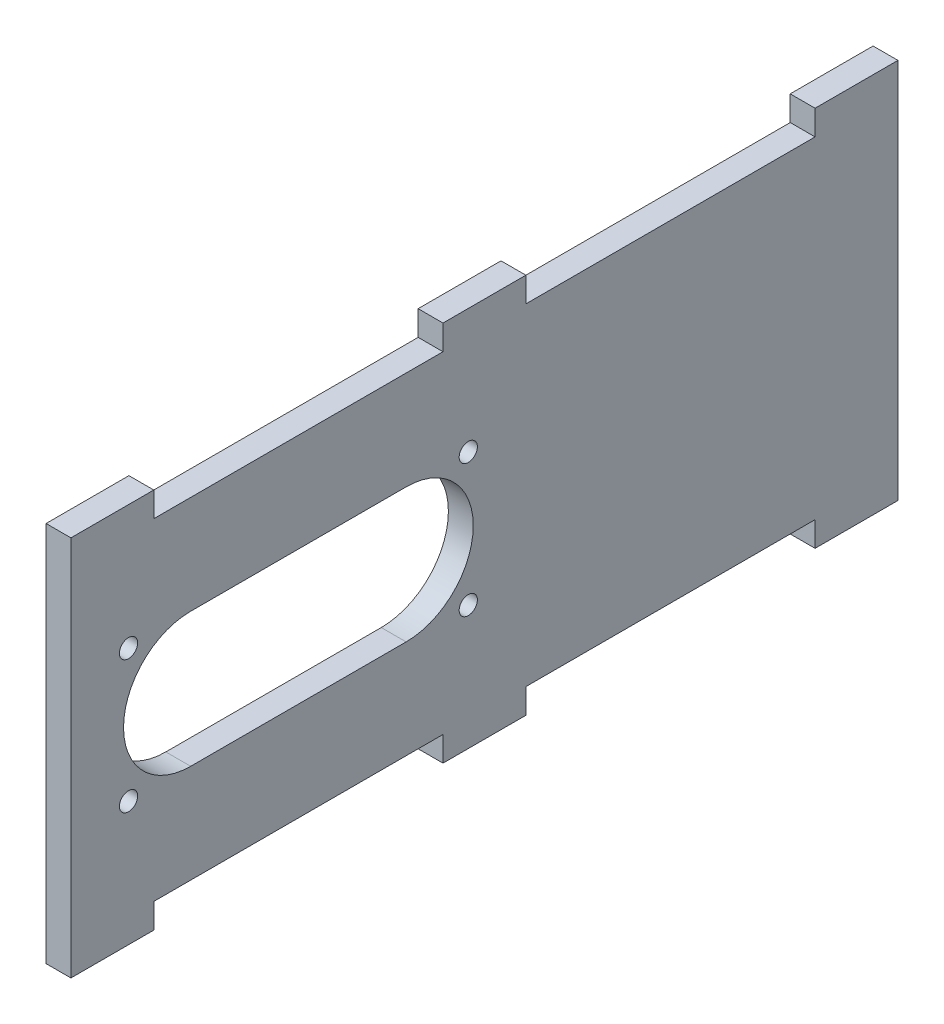
ISO-10303-21;
HEADER;
FILE_DESCRIPTION(('STEP AP214'),'2;1');
FILE_NAME('part.step','',(''),(''),'','','');
FILE_SCHEMA(('AUTOMOTIVE_DESIGN { 1 0 10303 214 1 1 1 1 }'));
ENDSEC;
DATA;
#1=APPLICATION_CONTEXT('core data for automotive mechanical design processes');
#2=APPLICATION_PROTOCOL_DEFINITION('international standard','automotive_design',2000,#1);
#3=PRODUCT_CONTEXT('',#1,'mechanical');
#4=PRODUCT('Part','Part','',(#3));
#5=PRODUCT_RELATED_PRODUCT_CATEGORY('part','',(#4));
#6=PRODUCT_DEFINITION_FORMATION('','',#4);
#7=PRODUCT_DEFINITION_CONTEXT('part definition',#1,'design');
#8=PRODUCT_DEFINITION('design','',#6,#7);
#9=PRODUCT_DEFINITION_SHAPE('','',#8);
#10=(LENGTH_UNIT() NAMED_UNIT(*) SI_UNIT(.MILLI.,.METRE.));
#11=(NAMED_UNIT(*) PLANE_ANGLE_UNIT() SI_UNIT($,.RADIAN.));
#12=(NAMED_UNIT(*) SI_UNIT($,.STERADIAN.) SOLID_ANGLE_UNIT());
#13=UNCERTAINTY_MEASURE_WITH_UNIT(LENGTH_MEASURE(1.E-05),#10,'distance_accuracy_value','');
#14=(GEOMETRIC_REPRESENTATION_CONTEXT(3) GLOBAL_UNCERTAINTY_ASSIGNED_CONTEXT((#13)) GLOBAL_UNIT_ASSIGNED_CONTEXT((#10,
#11,#12)) REPRESENTATION_CONTEXT('',''));
#15=CARTESIAN_POINT('',(0.,0.,0.));
#16=DIRECTION('',(0.,0.,1.));
#17=DIRECTION('',(1.,0.,0.));
#18=AXIS2_PLACEMENT_3D('',#15,#16,#17);
#19=CARTESIAN_POINT('',(3.,0.,-72.35));
#20=DIRECTION('',(0.,0.,-1.));
#21=DIRECTION('',(-1.,0.,0.));
#22=AXIS2_PLACEMENT_3D('',#19,#20,#21);
#23=PLANE('',#22);
#24=DIRECTION('',(0.,-1.,0.));
#25=VECTOR('',#24,1.);
#26=CARTESIAN_POINT('',(0.,0.,-72.35));
#27=LINE('',#26,#25);
#28=CARTESIAN_POINT('',(0.,23.,-72.35));
#29=VERTEX_POINT('',#28);
#30=CARTESIAN_POINT('',(0.,-23.,-72.35));
#31=VERTEX_POINT('',#30);
#32=EDGE_CURVE('E258',#29,#31,#27,.T.);
#33=ORIENTED_EDGE('',*,*,#32,.F.);
#34=DIRECTION('',(-1.,0.,0.));
#35=VECTOR('',#34,1.);
#36=CARTESIAN_POINT('',(3.,23.,-72.35));
#37=LINE('',#36,#35);
#38=CARTESIAN_POINT('',(3.,23.,-72.35));
#39=VERTEX_POINT('',#38);
#40=EDGE_CURVE('E11',#39,#29,#37,.T.);
#41=ORIENTED_EDGE('',*,*,#40,.F.);
#42=DIRECTION('',(0.,-1.,0.));
#43=VECTOR('',#42,1.);
#44=CARTESIAN_POINT('',(3.,0.,-72.35));
#45=LINE('',#44,#43);
#46=CARTESIAN_POINT('',(3.,-23.,-72.35));
#47=VERTEX_POINT('',#46);
#48=EDGE_CURVE('E262',#39,#47,#45,.T.);
#49=ORIENTED_EDGE('',*,*,#48,.T.);
#50=DIRECTION('',(-1.,0.,0.));
#51=VECTOR('',#50,1.);
#52=CARTESIAN_POINT('',(3.,-23.,-72.35));
#53=LINE('',#52,#51);
#54=EDGE_CURVE('E328',#47,#31,#53,.T.);
#55=ORIENTED_EDGE('',*,*,#54,.T.);
#56=EDGE_LOOP('',(#33,#41,#49,#55));
#57=FACE_BOUND('',#56,.T.);
#58=ADVANCED_FACE('F41',(#57),#23,.T.);
#59=CARTESIAN_POINT('',(3.,23.,0.));
#60=DIRECTION('',(0.,1.,0.));
#61=DIRECTION('',(0.,0.,1.));
#62=AXIS2_PLACEMENT_3D('',#59,#60,#61);
#63=PLANE('',#62);
#64=DIRECTION('',(0.,0.,-1.));
#65=VECTOR('',#64,1.);
#66=CARTESIAN_POINT('',(0.,23.,0.));
#67=LINE('',#66,#65);
#68=CARTESIAN_POINT('',(0.,23.,-62.35));
#69=VERTEX_POINT('',#68);
#70=EDGE_CURVE('E332',#69,#29,#67,.T.);
#71=ORIENTED_EDGE('',*,*,#70,.F.);
#72=DIRECTION('',(-1.,0.,0.));
#73=VECTOR('',#72,1.);
#74=CARTESIAN_POINT('',(3.,23.,-62.35));
#75=LINE('',#74,#73);
#76=CARTESIAN_POINT('',(3.,23.,-62.35));
#77=VERTEX_POINT('',#76);
#78=EDGE_CURVE('E49',#77,#69,#75,.T.);
#79=ORIENTED_EDGE('',*,*,#78,.F.);
#80=DIRECTION('',(0.,0.,-1.));
#81=VECTOR('',#80,1.);
#82=CARTESIAN_POINT('',(3.,23.,0.));
#83=LINE('',#82,#81);
#84=EDGE_CURVE('E266',#77,#39,#83,.T.);
#85=ORIENTED_EDGE('',*,*,#84,.T.);
#86=ORIENTED_EDGE('',*,*,#40,.T.);
#87=EDGE_LOOP('',(#71,#79,#85,#86));
#88=FACE_BOUND('',#87,.T.);
#89=ADVANCED_FACE('F462',(#88),#63,.T.);
#90=CARTESIAN_POINT('',(3.,1.44213344969539E-13,-62.3500000000001));
#91=DIRECTION('',(0.,0.,1.));
#92=DIRECTION('',(0.,-1.,0.));
#93=AXIS2_PLACEMENT_3D('',#90,#91,#92);
#94=PLANE('',#93);
#95=DIRECTION('',(0.,1.,0.));
#96=VECTOR('',#95,1.);
#97=CARTESIAN_POINT('',(0.,1.44213344969539E-13,-62.3500000000001));
#98=LINE('',#97,#96);
#99=CARTESIAN_POINT('',(0.,20.,-62.35));
#100=VERTEX_POINT('',#99);
#101=EDGE_CURVE('E336',#100,#69,#98,.T.);
#102=ORIENTED_EDGE('',*,*,#101,.F.);
#103=DIRECTION('',(-1.,0.,0.));
#104=VECTOR('',#103,1.);
#105=CARTESIAN_POINT('',(3.,20.,-62.35));
#106=LINE('',#105,#104);
#107=CARTESIAN_POINT('',(3.,20.,-62.35));
#108=VERTEX_POINT('',#107);
#109=EDGE_CURVE('E452',#108,#100,#106,.T.);
#110=ORIENTED_EDGE('',*,*,#109,.F.);
#111=DIRECTION('',(0.,1.,0.));
#112=VECTOR('',#111,1.);
#113=CARTESIAN_POINT('',(3.,1.44213344969539E-13,-62.3500000000001));
#114=LINE('',#113,#112);
#115=EDGE_CURVE('E271',#108,#77,#114,.T.);
#116=ORIENTED_EDGE('',*,*,#115,.T.);
#117=ORIENTED_EDGE('',*,*,#78,.T.);
#118=EDGE_LOOP('',(#102,#110,#116,#117));
#119=FACE_BOUND('',#118,.T.);
#120=ADVANCED_FACE('F458',(#119),#94,.T.);
#121=CARTESIAN_POINT('',(3.,20.,0.));
#122=DIRECTION('',(0.,1.,0.));
#123=DIRECTION('',(0.,0.,1.));
#124=AXIS2_PLACEMENT_3D('',#121,#122,#123);
#125=PLANE('',#124);
#126=DIRECTION('',(0.,0.,-1.));
#127=VECTOR('',#126,1.);
#128=CARTESIAN_POINT('',(0.,20.,0.));
#129=LINE('',#128,#127);
#130=CARTESIAN_POINT('',(0.,20.,-27.45));
#131=VERTEX_POINT('',#130);
#132=EDGE_CURVE('E340',#131,#100,#129,.T.);
#133=ORIENTED_EDGE('',*,*,#132,.F.);
#134=DIRECTION('',(-1.,0.,0.));
#135=VECTOR('',#134,1.);
#136=CARTESIAN_POINT('',(3.,20.,-27.45));
#137=LINE('',#136,#135);
#138=CARTESIAN_POINT('',(3.,20.,-27.45));
#139=VERTEX_POINT('',#138);
#140=EDGE_CURVE('E449',#139,#131,#137,.T.);
#141=ORIENTED_EDGE('',*,*,#140,.F.);
#142=DIRECTION('',(0.,0.,-1.));
#143=VECTOR('',#142,1.);
#144=CARTESIAN_POINT('',(3.,20.,0.));
#145=LINE('',#144,#143);
#146=EDGE_CURVE('E275',#139,#108,#145,.T.);
#147=ORIENTED_EDGE('',*,*,#146,.T.);
#148=ORIENTED_EDGE('',*,*,#109,.T.);
#149=EDGE_LOOP('',(#133,#141,#147,#148));
#150=FACE_BOUND('',#149,.T.);
#151=ADVANCED_FACE('F468',(#150),#125,.T.);
#152=CARTESIAN_POINT('',(3.,0.,-27.45));
#153=DIRECTION('',(0.,0.,1.));
#154=DIRECTION('',(1.,0.,0.));
#155=AXIS2_PLACEMENT_3D('',#152,#153,#154);
#156=PLANE('',#155);
#157=DIRECTION('',(0.,1.,0.));
#158=VECTOR('',#157,1.);
#159=CARTESIAN_POINT('',(0.,0.,-27.45));
#160=LINE('',#159,#158);
#161=CARTESIAN_POINT('',(0.,23.,-27.45));
#162=VERTEX_POINT('',#161);
#163=EDGE_CURVE('E344',#131,#162,#160,.T.);
#164=ORIENTED_EDGE('',*,*,#163,.T.);
#165=DIRECTION('',(-1.,0.,0.));
#166=VECTOR('',#165,1.);
#167=CARTESIAN_POINT('',(3.,23.,-27.45));
#168=LINE('',#167,#166);
#169=CARTESIAN_POINT('',(3.,23.,-27.45));
#170=VERTEX_POINT('',#169);
#171=EDGE_CURVE('E446',#170,#162,#168,.T.);
#172=ORIENTED_EDGE('',*,*,#171,.F.);
#173=DIRECTION('',(0.,1.,0.));
#174=VECTOR('',#173,1.);
#175=CARTESIAN_POINT('',(3.,0.,-27.45));
#176=LINE('',#175,#174);
#177=EDGE_CURVE('E279',#139,#170,#176,.T.);
#178=ORIENTED_EDGE('',*,*,#177,.F.);
#179=ORIENTED_EDGE('',*,*,#140,.T.);
#180=EDGE_LOOP('',(#164,#172,#178,#179));
#181=FACE_BOUND('',#180,.T.);
#182=ADVANCED_FACE('F512',(#181),#156,.F.);
#183=CARTESIAN_POINT('',(3.,23.,0.));
#184=DIRECTION('',(0.,1.,0.));
#185=DIRECTION('',(0.,0.,1.));
#186=AXIS2_PLACEMENT_3D('',#183,#184,#185);
#187=PLANE('',#186);
#188=DIRECTION('',(0.,0.,-1.));
#189=VECTOR('',#188,1.);
#190=CARTESIAN_POINT('',(0.,23.,0.));
#191=LINE('',#190,#189);
#192=CARTESIAN_POINT('',(0.,23.,-17.45));
#193=VERTEX_POINT('',#192);
#194=EDGE_CURVE('E349',#193,#162,#191,.T.);
#195=ORIENTED_EDGE('',*,*,#194,.F.);
#196=DIRECTION('',(-1.,0.,0.));
#197=VECTOR('',#196,1.);
#198=CARTESIAN_POINT('',(3.,23.,-17.45));
#199=LINE('',#198,#197);
#200=CARTESIAN_POINT('',(3.,23.,-17.45));
#201=VERTEX_POINT('',#200);
#202=EDGE_CURVE('E443',#201,#193,#199,.T.);
#203=ORIENTED_EDGE('',*,*,#202,.F.);
#204=DIRECTION('',(0.,0.,-1.));
#205=VECTOR('',#204,1.);
#206=CARTESIAN_POINT('',(3.,23.,0.));
#207=LINE('',#206,#205);
#208=EDGE_CURVE('E283',#201,#170,#207,.T.);
#209=ORIENTED_EDGE('',*,*,#208,.T.);
#210=ORIENTED_EDGE('',*,*,#171,.T.);
#211=EDGE_LOOP('',(#195,#203,#209,#210));
#212=FACE_BOUND('',#211,.T.);
#213=ADVANCED_FACE('F509',(#212),#187,.T.);
#214=CARTESIAN_POINT('',(3.,0.,-17.4500000000001));
#215=DIRECTION('',(0.,0.,1.));
#216=DIRECTION('',(0.,-1.,0.));
#217=AXIS2_PLACEMENT_3D('',#214,#215,#216);
#218=PLANE('',#217);
#219=DIRECTION('',(0.,1.,0.));
#220=VECTOR('',#219,1.);
#221=CARTESIAN_POINT('',(0.,0.,-17.4500000000001));
#222=LINE('',#221,#220);
#223=CARTESIAN_POINT('',(0.,20.,-17.45));
#224=VERTEX_POINT('',#223);
#225=EDGE_CURVE('E353',#224,#193,#222,.T.);
#226=ORIENTED_EDGE('',*,*,#225,.F.);
#227=DIRECTION('',(-1.,0.,0.));
#228=VECTOR('',#227,1.);
#229=CARTESIAN_POINT('',(3.,20.,-17.45));
#230=LINE('',#229,#228);
#231=CARTESIAN_POINT('',(3.,20.,-17.45));
#232=VERTEX_POINT('',#231);
#233=EDGE_CURVE('E440',#232,#224,#230,.T.);
#234=ORIENTED_EDGE('',*,*,#233,.F.);
#235=DIRECTION('',(0.,1.,0.));
#236=VECTOR('',#235,1.);
#237=CARTESIAN_POINT('',(3.,0.,-17.4500000000001));
#238=LINE('',#237,#236);
#239=EDGE_CURVE('E287',#232,#201,#238,.T.);
#240=ORIENTED_EDGE('',*,*,#239,.T.);
#241=ORIENTED_EDGE('',*,*,#202,.T.);
#242=EDGE_LOOP('',(#226,#234,#240,#241));
#243=FACE_BOUND('',#242,.T.);
#244=ADVANCED_FACE('F505',(#243),#218,.T.);
#245=CARTESIAN_POINT('',(0.,20.,17.45));
#246=VERTEX_POINT('',#245);
#247=EDGE_CURVE('E345',#246,#224,#129,.T.);
#248=ORIENTED_EDGE('',*,*,#247,.F.);
#249=DIRECTION('',(-1.,0.,0.));
#250=VECTOR('',#249,1.);
#251=CARTESIAN_POINT('',(3.,20.,17.45));
#252=LINE('',#251,#250);
#253=CARTESIAN_POINT('',(3.,20.,17.45));
#254=VERTEX_POINT('',#253);
#255=EDGE_CURVE('E437',#254,#246,#252,.T.);
#256=ORIENTED_EDGE('',*,*,#255,.F.);
#257=EDGE_CURVE('E280',#254,#232,#145,.T.);
#258=ORIENTED_EDGE('',*,*,#257,.T.);
#259=ORIENTED_EDGE('',*,*,#233,.T.);
#260=EDGE_LOOP('',(#248,#256,#258,#259));
#261=FACE_BOUND('',#260,.T.);
#262=ADVANCED_FACE('F499',(#261),#125,.T.);
#263=CARTESIAN_POINT('',(3.,0.,17.45));
#264=DIRECTION('',(0.,0.,1.));
#265=DIRECTION('',(1.,0.,0.));
#266=AXIS2_PLACEMENT_3D('',#263,#264,#265);
#267=PLANE('',#266);
#268=DIRECTION('',(0.,1.,0.));
#269=VECTOR('',#268,1.);
#270=CARTESIAN_POINT('',(0.,0.,17.45));
#271=LINE('',#270,#269);
#272=CARTESIAN_POINT('',(0.,23.,17.45));
#273=VERTEX_POINT('',#272);
#274=EDGE_CURVE('E357',#246,#273,#271,.T.);
#275=ORIENTED_EDGE('',*,*,#274,.T.);
#276=DIRECTION('',(-1.,0.,0.));
#277=VECTOR('',#276,1.);
#278=CARTESIAN_POINT('',(3.,23.,17.45));
#279=LINE('',#278,#277);
#280=CARTESIAN_POINT('',(3.,23.,17.45));
#281=VERTEX_POINT('',#280);
#282=EDGE_CURVE('E434',#281,#273,#279,.T.);
#283=ORIENTED_EDGE('',*,*,#282,.F.);
#284=DIRECTION('',(0.,1.,0.));
#285=VECTOR('',#284,1.);
#286=CARTESIAN_POINT('',(3.,0.,17.45));
#287=LINE('',#286,#285);
#288=EDGE_CURVE('E291',#254,#281,#287,.T.);
#289=ORIENTED_EDGE('',*,*,#288,.F.);
#290=ORIENTED_EDGE('',*,*,#255,.T.);
#291=EDGE_LOOP('',(#275,#283,#289,#290));
#292=FACE_BOUND('',#291,.T.);
#293=ADVANCED_FACE('F551',(#292),#267,.F.);
#294=CARTESIAN_POINT('',(3.,23.,0.));
#295=DIRECTION('',(0.,1.,0.));
#296=DIRECTION('',(0.,0.,1.));
#297=AXIS2_PLACEMENT_3D('',#294,#295,#296);
#298=PLANE('',#297);
#299=DIRECTION('',(0.,0.,-1.));
#300=VECTOR('',#299,1.);
#301=CARTESIAN_POINT('',(0.,23.,0.));
#302=LINE('',#301,#300);
#303=CARTESIAN_POINT('',(0.,23.,27.45));
#304=VERTEX_POINT('',#303);
#305=EDGE_CURVE('E361',#304,#273,#302,.T.);
#306=ORIENTED_EDGE('',*,*,#305,.F.);
#307=DIRECTION('',(-1.,0.,0.));
#308=VECTOR('',#307,1.);
#309=CARTESIAN_POINT('',(3.,23.,27.45));
#310=LINE('',#309,#308);
#311=CARTESIAN_POINT('',(3.,23.,27.45));
#312=VERTEX_POINT('',#311);
#313=EDGE_CURVE('E431',#312,#304,#310,.T.);
#314=ORIENTED_EDGE('',*,*,#313,.F.);
#315=DIRECTION('',(0.,0.,-1.));
#316=VECTOR('',#315,1.);
#317=CARTESIAN_POINT('',(3.,23.,0.));
#318=LINE('',#317,#316);
#319=EDGE_CURVE('E294',#312,#281,#318,.T.);
#320=ORIENTED_EDGE('',*,*,#319,.T.);
#321=ORIENTED_EDGE('',*,*,#282,.T.);
#322=EDGE_LOOP('',(#306,#314,#320,#321));
#323=FACE_BOUND('',#322,.T.);
#324=ADVANCED_FACE('F548',(#323),#298,.T.);
#325=CARTESIAN_POINT('',(3.,0.,27.45));
#326=DIRECTION('',(0.,0.,-1.));
#327=DIRECTION('',(0.,1.,0.));
#328=AXIS2_PLACEMENT_3D('',#325,#326,#327);
#329=PLANE('',#328);
#330=DIRECTION('',(0.,-1.,0.));
#331=VECTOR('',#330,1.);
#332=CARTESIAN_POINT('',(0.,0.,27.45));
#333=LINE('',#332,#331);
#334=CARTESIAN_POINT('',(0.,-23.,27.45));
#335=VERTEX_POINT('',#334);
#336=EDGE_CURVE('E365',#304,#335,#333,.T.);
#337=ORIENTED_EDGE('',*,*,#336,.T.);
#338=DIRECTION('',(-1.,0.,0.));
#339=VECTOR('',#338,1.);
#340=CARTESIAN_POINT('',(3.,-23.,27.45));
#341=LINE('',#340,#339);
#342=CARTESIAN_POINT('',(3.,-23.,27.45));
#343=VERTEX_POINT('',#342);
#344=EDGE_CURVE('E427',#343,#335,#341,.T.);
#345=ORIENTED_EDGE('',*,*,#344,.F.);
#346=DIRECTION('',(0.,-1.,0.));
#347=VECTOR('',#346,1.);
#348=CARTESIAN_POINT('',(3.,0.,27.45));
#349=LINE('',#348,#347);
#350=EDGE_CURVE('E298',#312,#343,#349,.T.);
#351=ORIENTED_EDGE('',*,*,#350,.F.);
#352=ORIENTED_EDGE('',*,*,#313,.T.);
#353=EDGE_LOOP('',(#337,#345,#351,#352));
#354=FACE_BOUND('',#353,.T.);
#355=ADVANCED_FACE('F558',(#354),#329,.F.);
#356=CARTESIAN_POINT('',(3.,-23.,0.));
#357=DIRECTION('',(0.,1.,0.));
#358=DIRECTION('',(0.,0.,1.));
#359=AXIS2_PLACEMENT_3D('',#356,#357,#358);
#360=PLANE('',#359);
#361=DIRECTION('',(0.,0.,-1.));
#362=VECTOR('',#361,1.);
#363=CARTESIAN_POINT('',(0.,-23.,0.));
#364=LINE('',#363,#362);
#365=CARTESIAN_POINT('',(0.,-23.,17.45));
#366=VERTEX_POINT('',#365);
#367=EDGE_CURVE('E368',#335,#366,#364,.T.);
#368=ORIENTED_EDGE('',*,*,#367,.T.);
#369=DIRECTION('',(-1.,0.,0.));
#370=VECTOR('',#369,1.);
#371=CARTESIAN_POINT('',(3.,-23.,17.45));
#372=LINE('',#371,#370);
#373=CARTESIAN_POINT('',(3.,-23.,17.45));
#374=VERTEX_POINT('',#373);
#375=EDGE_CURVE('E424',#374,#366,#372,.T.);
#376=ORIENTED_EDGE('',*,*,#375,.F.);
#377=DIRECTION('',(0.,0.,-1.));
#378=VECTOR('',#377,1.);
#379=CARTESIAN_POINT('',(3.,-23.,0.));
#380=LINE('',#379,#378);
#381=EDGE_CURVE('E301',#343,#374,#380,.T.);
#382=ORIENTED_EDGE('',*,*,#381,.F.);
#383=ORIENTED_EDGE('',*,*,#344,.T.);
#384=EDGE_LOOP('',(#368,#376,#382,#383));
#385=FACE_BOUND('',#384,.T.);
#386=ADVANCED_FACE('F542',(#385),#360,.F.);
#387=CARTESIAN_POINT('',(3.,1.81625547934769E-13,17.4499999999998));
#388=DIRECTION('',(0.,0.,-1.));
#389=DIRECTION('',(0.,1.,0.));
#390=AXIS2_PLACEMENT_3D('',#387,#388,#389);
#391=PLANE('',#390);
#392=DIRECTION('',(0.,-1.,0.));
#393=VECTOR('',#392,1.);
#394=CARTESIAN_POINT('',(0.,1.81625547934769E-13,17.4499999999998));
#395=LINE('',#394,#393);
#396=CARTESIAN_POINT('',(0.,-20.,17.45));
#397=VERTEX_POINT('',#396);
#398=EDGE_CURVE('E372',#397,#366,#395,.T.);
#399=ORIENTED_EDGE('',*,*,#398,.F.);
#400=DIRECTION('',(-1.,0.,0.));
#401=VECTOR('',#400,1.);
#402=CARTESIAN_POINT('',(3.,-20.,17.45));
#403=LINE('',#402,#401);
#404=CARTESIAN_POINT('',(3.,-20.,17.45));
#405=VERTEX_POINT('',#404);
#406=EDGE_CURVE('E421',#405,#397,#403,.T.);
#407=ORIENTED_EDGE('',*,*,#406,.F.);
#408=DIRECTION('',(0.,-1.,0.));
#409=VECTOR('',#408,1.);
#410=CARTESIAN_POINT('',(3.,1.81625547934769E-13,17.4499999999998));
#411=LINE('',#410,#409);
#412=EDGE_CURVE('E304',#405,#374,#411,.T.);
#413=ORIENTED_EDGE('',*,*,#412,.T.);
#414=ORIENTED_EDGE('',*,*,#375,.T.);
#415=EDGE_LOOP('',(#399,#407,#413,#414));
#416=FACE_BOUND('',#415,.T.);
#417=ADVANCED_FACE('F538',(#416),#391,.T.);
#418=CARTESIAN_POINT('',(3.,-20.,0.));
#419=DIRECTION('',(0.,1.,0.));
#420=DIRECTION('',(0.,0.,1.));
#421=AXIS2_PLACEMENT_3D('',#418,#419,#420);
#422=PLANE('',#421);
#423=DIRECTION('',(0.,0.,-1.));
#424=VECTOR('',#423,1.);
#425=CARTESIAN_POINT('',(0.,-20.,0.));
#426=LINE('',#425,#424);
#427=CARTESIAN_POINT('',(0.,-20.,-17.45));
#428=VERTEX_POINT('',#427);
#429=EDGE_CURVE('E376',#397,#428,#426,.T.);
#430=ORIENTED_EDGE('',*,*,#429,.T.);
#431=DIRECTION('',(-1.,0.,0.));
#432=VECTOR('',#431,1.);
#433=CARTESIAN_POINT('',(3.,-20.,-17.45));
#434=LINE('',#433,#432);
#435=CARTESIAN_POINT('',(3.,-20.,-17.45));
#436=VERTEX_POINT('',#435);
#437=EDGE_CURVE('E417',#436,#428,#434,.T.);
#438=ORIENTED_EDGE('',*,*,#437,.F.);
#439=DIRECTION('',(0.,0.,-1.));
#440=VECTOR('',#439,1.);
#441=CARTESIAN_POINT('',(3.,-20.,0.));
#442=LINE('',#441,#440);
#443=EDGE_CURVE('E308',#405,#436,#442,.T.);
#444=ORIENTED_EDGE('',*,*,#443,.F.);
#445=ORIENTED_EDGE('',*,*,#406,.T.);
#446=EDGE_LOOP('',(#430,#438,#444,#445));
#447=FACE_BOUND('',#446,.T.);
#448=ADVANCED_FACE('F533',(#447),#422,.F.);
#449=CARTESIAN_POINT('',(3.,1.00903082185984E-13,-17.4499999999999));
#450=DIRECTION('',(0.,0.,-1.));
#451=DIRECTION('',(0.,1.,0.));
#452=AXIS2_PLACEMENT_3D('',#449,#450,#451);
#453=PLANE('',#452);
#454=DIRECTION('',(0.,-1.,0.));
#455=VECTOR('',#454,1.);
#456=CARTESIAN_POINT('',(0.,1.00903082185984E-13,-17.4499999999999));
#457=LINE('',#456,#455);
#458=CARTESIAN_POINT('',(0.,-23.,-17.45));
#459=VERTEX_POINT('',#458);
#460=EDGE_CURVE('E379',#428,#459,#457,.T.);
#461=ORIENTED_EDGE('',*,*,#460,.T.);
#462=DIRECTION('',(-1.,0.,0.));
#463=VECTOR('',#462,1.);
#464=CARTESIAN_POINT('',(3.,-23.,-17.45));
#465=LINE('',#464,#463);
#466=CARTESIAN_POINT('',(3.,-23.,-17.45));
#467=VERTEX_POINT('',#466);
#468=EDGE_CURVE('E413',#467,#459,#465,.T.);
#469=ORIENTED_EDGE('',*,*,#468,.F.);
#470=DIRECTION('',(0.,-1.,0.));
#471=VECTOR('',#470,1.);
#472=CARTESIAN_POINT('',(3.,1.00903082185984E-13,-17.4499999999999));
#473=LINE('',#472,#471);
#474=EDGE_CURVE('E311',#436,#467,#473,.T.);
#475=ORIENTED_EDGE('',*,*,#474,.F.);
#476=ORIENTED_EDGE('',*,*,#437,.T.);
#477=EDGE_LOOP('',(#461,#469,#475,#476));
#478=FACE_BOUND('',#477,.T.);
#479=ADVANCED_FACE('F529',(#478),#453,.F.);
#480=CARTESIAN_POINT('',(3.,-23.,0.));
#481=DIRECTION('',(0.,1.,0.));
#482=DIRECTION('',(0.,0.,1.));
#483=AXIS2_PLACEMENT_3D('',#480,#481,#482);
#484=PLANE('',#483);
#485=DIRECTION('',(0.,0.,-1.));
#486=VECTOR('',#485,1.);
#487=CARTESIAN_POINT('',(0.,-23.,0.));
#488=LINE('',#487,#486);
#489=CARTESIAN_POINT('',(0.,-23.,-27.45));
#490=VERTEX_POINT('',#489);
#491=EDGE_CURVE('E383',#459,#490,#488,.T.);
#492=ORIENTED_EDGE('',*,*,#491,.T.);
#493=DIRECTION('',(-1.,0.,0.));
#494=VECTOR('',#493,1.);
#495=CARTESIAN_POINT('',(3.,-23.,-27.45));
#496=LINE('',#495,#494);
#497=CARTESIAN_POINT('',(3.,-23.,-27.45));
#498=VERTEX_POINT('',#497);
#499=EDGE_CURVE('E410',#498,#490,#496,.T.);
#500=ORIENTED_EDGE('',*,*,#499,.F.);
#501=DIRECTION('',(0.,0.,-1.));
#502=VECTOR('',#501,1.);
#503=CARTESIAN_POINT('',(3.,-23.,0.));
#504=LINE('',#503,#502);
#505=EDGE_CURVE('E315',#467,#498,#504,.T.);
#506=ORIENTED_EDGE('',*,*,#505,.F.);
#507=ORIENTED_EDGE('',*,*,#468,.T.);
#508=EDGE_LOOP('',(#492,#500,#506,#507));
#509=FACE_BOUND('',#508,.T.);
#510=ADVANCED_FACE('F525',(#509),#484,.F.);
#511=CARTESIAN_POINT('',(3.,0.,-27.45));
#512=DIRECTION('',(0.,0.,-1.));
#513=DIRECTION('',(-1.,0.,0.));
#514=AXIS2_PLACEMENT_3D('',#511,#512,#513);
#515=PLANE('',#514);
#516=DIRECTION('',(0.,-1.,0.));
#517=VECTOR('',#516,1.);
#518=CARTESIAN_POINT('',(0.,0.,-27.45));
#519=LINE('',#518,#517);
#520=CARTESIAN_POINT('',(0.,-20.,-27.45));
#521=VERTEX_POINT('',#520);
#522=EDGE_CURVE('E387',#521,#490,#519,.T.);
#523=ORIENTED_EDGE('',*,*,#522,.F.);
#524=DIRECTION('',(-1.,0.,0.));
#525=VECTOR('',#524,1.);
#526=CARTESIAN_POINT('',(3.,-20.,-27.45));
#527=LINE('',#526,#525);
#528=CARTESIAN_POINT('',(3.,-20.,-27.45));
#529=VERTEX_POINT('',#528);
#530=EDGE_CURVE('E407',#529,#521,#527,.T.);
#531=ORIENTED_EDGE('',*,*,#530,.F.);
#532=DIRECTION('',(0.,-1.,0.));
#533=VECTOR('',#532,1.);
#534=CARTESIAN_POINT('',(3.,0.,-27.45));
#535=LINE('',#534,#533);
#536=EDGE_CURVE('E318',#529,#498,#535,.T.);
#537=ORIENTED_EDGE('',*,*,#536,.T.);
#538=ORIENTED_EDGE('',*,*,#499,.T.);
#539=EDGE_LOOP('',(#523,#531,#537,#538));
#540=FACE_BOUND('',#539,.T.);
#541=ADVANCED_FACE('F520',(#540),#515,.T.);
#542=CARTESIAN_POINT('',(0.,-20.,-62.35));
#543=VERTEX_POINT('',#542);
#544=EDGE_CURVE('E380',#521,#543,#426,.T.);
#545=ORIENTED_EDGE('',*,*,#544,.T.);
#546=DIRECTION('',(-1.,0.,0.));
#547=VECTOR('',#546,1.);
#548=CARTESIAN_POINT('',(3.,-20.,-62.35));
#549=LINE('',#548,#547);
#550=CARTESIAN_POINT('',(3.,-20.,-62.35));
#551=VERTEX_POINT('',#550);
#552=EDGE_CURVE('E403',#551,#543,#549,.T.);
#553=ORIENTED_EDGE('',*,*,#552,.F.);
#554=EDGE_CURVE('E312',#529,#551,#442,.T.);
#555=ORIENTED_EDGE('',*,*,#554,.F.);
#556=ORIENTED_EDGE('',*,*,#530,.T.);
#557=EDGE_LOOP('',(#545,#553,#555,#556));
#558=FACE_BOUND('',#557,.T.);
#559=ADVANCED_FACE('F489',(#558),#422,.F.);
#560=CARTESIAN_POINT('',(3.,-1.44213344969539E-13,-62.3500000000001));
#561=DIRECTION('',(0.,0.,-1.));
#562=DIRECTION('',(0.,1.,0.));
#563=AXIS2_PLACEMENT_3D('',#560,#561,#562);
#564=PLANE('',#563);
#565=DIRECTION('',(0.,-1.,0.));
#566=VECTOR('',#565,1.);
#567=CARTESIAN_POINT('',(0.,-1.44213344969539E-13,-62.3500000000001));
#568=LINE('',#567,#566);
#569=CARTESIAN_POINT('',(0.,-23.,-62.35));
#570=VERTEX_POINT('',#569);
#571=EDGE_CURVE('E391',#543,#570,#568,.T.);
#572=ORIENTED_EDGE('',*,*,#571,.T.);
#573=DIRECTION('',(-1.,0.,0.));
#574=VECTOR('',#573,1.);
#575=CARTESIAN_POINT('',(3.,-23.,-62.35));
#576=LINE('',#575,#574);
#577=CARTESIAN_POINT('',(3.,-23.,-62.35));
#578=VERTEX_POINT('',#577);
#579=EDGE_CURVE('E399',#578,#570,#576,.T.);
#580=ORIENTED_EDGE('',*,*,#579,.F.);
#581=DIRECTION('',(0.,-1.,0.));
#582=VECTOR('',#581,1.);
#583=CARTESIAN_POINT('',(3.,-1.44213344969539E-13,-62.3500000000001));
#584=LINE('',#583,#582);
#585=EDGE_CURVE('E322',#551,#578,#584,.T.);
#586=ORIENTED_EDGE('',*,*,#585,.F.);
#587=ORIENTED_EDGE('',*,*,#552,.T.);
#588=EDGE_LOOP('',(#572,#580,#586,#587));
#589=FACE_BOUND('',#588,.T.);
#590=ADVANCED_FACE('F485',(#589),#564,.F.);
#591=CARTESIAN_POINT('',(3.,-23.,0.));
#592=DIRECTION('',(0.,1.,0.));
#593=DIRECTION('',(0.,0.,1.));
#594=AXIS2_PLACEMENT_3D('',#591,#592,#593);
#595=PLANE('',#594);
#596=DIRECTION('',(0.,0.,-1.));
#597=VECTOR('',#596,1.);
#598=CARTESIAN_POINT('',(0.,-23.,0.));
#599=LINE('',#598,#597);
#600=EDGE_CURVE('E267',#570,#31,#599,.T.);
#601=ORIENTED_EDGE('',*,*,#600,.T.);
#602=ORIENTED_EDGE('',*,*,#54,.F.);
#603=DIRECTION('',(0.,0.,-1.));
#604=VECTOR('',#603,1.);
#605=CARTESIAN_POINT('',(3.,-23.,0.));
#606=LINE('',#605,#604);
#607=EDGE_CURVE('E325',#578,#47,#606,.T.);
#608=ORIENTED_EDGE('',*,*,#607,.F.);
#609=ORIENTED_EDGE('',*,*,#579,.T.);
#610=EDGE_LOOP('',(#601,#602,#608,#609));
#611=FACE_BOUND('',#610,.T.);
#612=ADVANCED_FACE('F481',(#611),#595,.F.);
#613=CARTESIAN_POINT('',(3.,0.,0.));
#614=DIRECTION('',(1.,0.,0.));
#615=DIRECTION('',(0.,0.,-1.));
#616=AXIS2_PLACEMENT_3D('',#613,#614,#615);
#617=PLANE('',#616);
#618=CARTESIAN_POINT('',(3.,-8.,20.5));
#619=DIRECTION('',(1.,0.,0.));
#620=DIRECTION('',(0.,0.,-1.));
#621=AXIS2_PLACEMENT_3D('',#618,#619,#620);
#622=CIRCLE('',#621,1.1);
#623=CARTESIAN_POINT('',(3.,-8.,19.4));
#624=VERTEX_POINT('',#623);
#625=EDGE_CURVE('E229',#624,#624,#622,.T.);
#626=ORIENTED_EDGE('',*,*,#625,.F.);
#627=EDGE_LOOP('',(#626));
#628=FACE_BOUND('',#627,.T.);
#629=CARTESIAN_POINT('',(3.,0.,13.));
#630=DIRECTION('',(1.,0.,0.));
#631=DIRECTION('',(0.,0.,-1.));
#632=AXIS2_PLACEMENT_3D('',#629,#630,#631);
#633=CIRCLE('',#632,8.1);
#634=CARTESIAN_POINT('',(3.,8.1,13.));
#635=VERTEX_POINT('',#634);
#636=CARTESIAN_POINT('',(3.,-8.1,13.));
#637=VERTEX_POINT('',#636);
#638=EDGE_CURVE('E56',#635,#637,#633,.T.);
#639=ORIENTED_EDGE('',*,*,#638,.F.);
#640=DIRECTION('',(0.,0.,1.));
#641=VECTOR('',#640,1.);
#642=CARTESIAN_POINT('',(3.,8.1,13.));
#643=LINE('',#642,#641);
#644=CARTESIAN_POINT('',(3.,8.1,-13.));
#645=VERTEX_POINT('',#644);
#646=EDGE_CURVE('E222',#645,#635,#643,.T.);
#647=ORIENTED_EDGE('',*,*,#646,.F.);
#648=CARTESIAN_POINT('',(3.,0.,-13.));
#649=DIRECTION('',(1.,0.,0.));
#650=DIRECTION('',(0.,0.,-1.));
#651=AXIS2_PLACEMENT_3D('',#648,#649,#650);
#652=CIRCLE('',#651,8.1);
#653=CARTESIAN_POINT('',(3.,-8.1,-13.));
#654=VERTEX_POINT('',#653);
#655=EDGE_CURVE('E226',#654,#645,#652,.T.);
#656=ORIENTED_EDGE('',*,*,#655,.F.);
#657=DIRECTION('',(0.,0.,-1.));
#658=VECTOR('',#657,1.);
#659=CARTESIAN_POINT('',(3.,-8.1,13.));
#660=LINE('',#659,#658);
#661=EDGE_CURVE('E238',#637,#654,#660,.T.);
#662=ORIENTED_EDGE('',*,*,#661,.F.);
#663=EDGE_LOOP('',(#639,#647,#656,#662));
#664=FACE_BOUND('',#663,.T.);
#665=CARTESIAN_POINT('',(3.,8.,-20.5));
#666=DIRECTION('',(1.,0.,0.));
#667=DIRECTION('',(0.,0.,-1.));
#668=AXIS2_PLACEMENT_3D('',#665,#666,#667);
#669=CIRCLE('',#668,1.1);
#670=CARTESIAN_POINT('',(3.,8.,-21.6));
#671=VERTEX_POINT('',#670);
#672=EDGE_CURVE('E790',#671,#671,#669,.T.);
#673=ORIENTED_EDGE('',*,*,#672,.F.);
#674=EDGE_LOOP('',(#673));
#675=FACE_BOUND('',#674,.T.);
#676=CARTESIAN_POINT('',(3.,-8.,-20.5));
#677=DIRECTION('',(1.,0.,0.));
#678=DIRECTION('',(0.,0.,-1.));
#679=AXIS2_PLACEMENT_3D('',#676,#677,#678);
#680=CIRCLE('',#679,1.1);
#681=CARTESIAN_POINT('',(3.,-8.,-21.6));
#682=VERTEX_POINT('',#681);
#683=EDGE_CURVE('E801',#682,#682,#680,.T.);
#684=ORIENTED_EDGE('',*,*,#683,.F.);
#685=EDGE_LOOP('',(#684));
#686=FACE_BOUND('',#685,.T.);
#687=CARTESIAN_POINT('',(3.,8.,20.5));
#688=DIRECTION('',(1.,0.,0.));
#689=DIRECTION('',(0.,0.,-1.));
#690=AXIS2_PLACEMENT_3D('',#687,#688,#689);
#691=CIRCLE('',#690,1.1);
#692=CARTESIAN_POINT('',(3.,8.,19.4));
#693=VERTEX_POINT('',#692);
#694=EDGE_CURVE('E248',#693,#693,#691,.T.);
#695=ORIENTED_EDGE('',*,*,#694,.F.);
#696=EDGE_LOOP('',(#695));
#697=FACE_BOUND('',#696,.T.);
#698=ORIENTED_EDGE('',*,*,#48,.F.);
#699=ORIENTED_EDGE('',*,*,#84,.F.);
#700=ORIENTED_EDGE('',*,*,#115,.F.);
#701=ORIENTED_EDGE('',*,*,#146,.F.);
#702=ORIENTED_EDGE('',*,*,#177,.T.);
#703=ORIENTED_EDGE('',*,*,#208,.F.);
#704=ORIENTED_EDGE('',*,*,#239,.F.);
#705=ORIENTED_EDGE('',*,*,#257,.F.);
#706=ORIENTED_EDGE('',*,*,#288,.T.);
#707=ORIENTED_EDGE('',*,*,#319,.F.);
#708=ORIENTED_EDGE('',*,*,#350,.T.);
#709=ORIENTED_EDGE('',*,*,#381,.T.);
#710=ORIENTED_EDGE('',*,*,#412,.F.);
#711=ORIENTED_EDGE('',*,*,#443,.T.);
#712=ORIENTED_EDGE('',*,*,#474,.T.);
#713=ORIENTED_EDGE('',*,*,#505,.T.);
#714=ORIENTED_EDGE('',*,*,#536,.F.);
#715=ORIENTED_EDGE('',*,*,#554,.T.);
#716=ORIENTED_EDGE('',*,*,#585,.T.);
#717=ORIENTED_EDGE('',*,*,#607,.T.);
#718=EDGE_LOOP('',(#698,#699,#700,#701,#702,#703,#704,#705,#706,#707,#708,#709,#710,#711,#712,
#713,#714,#715,#716,#717));
#719=FACE_BOUND('',#718,.T.);
#720=ADVANCED_FACE('F473',(#628,#664,#675,#686,#697,#719),#617,.T.);
#721=CARTESIAN_POINT('',(0.,0.,0.));
#722=DIRECTION('',(1.,0.,0.));
#723=DIRECTION('',(0.,0.,-1.));
#724=AXIS2_PLACEMENT_3D('',#721,#722,#723);
#725=PLANE('',#724);
#726=CARTESIAN_POINT('',(0.,-8.,20.5));
#727=DIRECTION('',(1.,0.,0.));
#728=DIRECTION('',(0.,0.,-1.));
#729=AXIS2_PLACEMENT_3D('',#726,#727,#728);
#730=CIRCLE('',#729,1.1);
#731=CARTESIAN_POINT('',(0.,-8.,19.4));
#732=VERTEX_POINT('',#731);
#733=EDGE_CURVE('E239',#732,#732,#730,.T.);
#734=ORIENTED_EDGE('',*,*,#733,.T.);
#735=EDGE_LOOP('',(#734));
#736=FACE_BOUND('',#735,.T.);
#737=DIRECTION('',(0.,0.,1.));
#738=VECTOR('',#737,1.);
#739=CARTESIAN_POINT('',(0.,8.1,13.));
#740=LINE('',#739,#738);
#741=CARTESIAN_POINT('',(0.,8.1,-13.));
#742=VERTEX_POINT('',#741);
#743=CARTESIAN_POINT('',(0.,8.1,13.));
#744=VERTEX_POINT('',#743);
#745=EDGE_CURVE('E210',#742,#744,#740,.T.);
#746=ORIENTED_EDGE('',*,*,#745,.T.);
#747=CARTESIAN_POINT('',(0.,0.,13.));
#748=DIRECTION('',(1.,0.,0.));
#749=DIRECTION('',(0.,0.,-1.));
#750=AXIS2_PLACEMENT_3D('',#747,#748,#749);
#751=CIRCLE('',#750,8.1);
#752=CARTESIAN_POINT('',(0.,-8.1,13.));
#753=VERTEX_POINT('',#752);
#754=EDGE_CURVE('E203',#744,#753,#751,.T.);
#755=ORIENTED_EDGE('',*,*,#754,.T.);
#756=DIRECTION('',(0.,0.,-1.));
#757=VECTOR('',#756,1.);
#758=CARTESIAN_POINT('',(0.,-8.1,13.));
#759=LINE('',#758,#757);
#760=CARTESIAN_POINT('',(0.,-8.1,-13.));
#761=VERTEX_POINT('',#760);
#762=EDGE_CURVE('E213',#753,#761,#759,.T.);
#763=ORIENTED_EDGE('',*,*,#762,.T.);
#764=CARTESIAN_POINT('',(0.,0.,-13.));
#765=DIRECTION('',(1.,0.,0.));
#766=DIRECTION('',(0.,0.,-1.));
#767=AXIS2_PLACEMENT_3D('',#764,#765,#766);
#768=CIRCLE('',#767,8.1);
#769=EDGE_CURVE('E64',#761,#742,#768,.T.);
#770=ORIENTED_EDGE('',*,*,#769,.T.);
#771=EDGE_LOOP('',(#746,#755,#763,#770));
#772=FACE_BOUND('',#771,.T.);
#773=CARTESIAN_POINT('',(0.,8.,-20.5));
#774=DIRECTION('',(1.,0.,0.));
#775=DIRECTION('',(0.,0.,-1.));
#776=AXIS2_PLACEMENT_3D('',#773,#774,#775);
#777=CIRCLE('',#776,1.1);
#778=CARTESIAN_POINT('',(0.,8.,-21.6));
#779=VERTEX_POINT('',#778);
#780=EDGE_CURVE('E786',#779,#779,#777,.T.);
#781=ORIENTED_EDGE('',*,*,#780,.T.);
#782=EDGE_LOOP('',(#781));
#783=FACE_BOUND('',#782,.T.);
#784=CARTESIAN_POINT('',(0.,-8.,-20.5));
#785=DIRECTION('',(1.,0.,0.));
#786=DIRECTION('',(0.,0.,-1.));
#787=AXIS2_PLACEMENT_3D('',#784,#785,#786);
#788=CIRCLE('',#787,1.1);
#789=CARTESIAN_POINT('',(0.,-8.,-21.6));
#790=VERTEX_POINT('',#789);
#791=EDGE_CURVE('E795',#790,#790,#788,.T.);
#792=ORIENTED_EDGE('',*,*,#791,.T.);
#793=EDGE_LOOP('',(#792));
#794=FACE_BOUND('',#793,.T.);
#795=CARTESIAN_POINT('',(0.,8.,20.5));
#796=DIRECTION('',(1.,0.,0.));
#797=DIRECTION('',(0.,0.,-1.));
#798=AXIS2_PLACEMENT_3D('',#795,#796,#797);
#799=CIRCLE('',#798,1.1);
#800=CARTESIAN_POINT('',(0.,8.,19.4));
#801=VERTEX_POINT('',#800);
#802=EDGE_CURVE('E254',#801,#801,#799,.T.);
#803=ORIENTED_EDGE('',*,*,#802,.T.);
#804=EDGE_LOOP('',(#803));
#805=FACE_BOUND('',#804,.T.);
#806=ORIENTED_EDGE('',*,*,#32,.T.);
#807=ORIENTED_EDGE('',*,*,#600,.F.);
#808=ORIENTED_EDGE('',*,*,#571,.F.);
#809=ORIENTED_EDGE('',*,*,#544,.F.);
#810=ORIENTED_EDGE('',*,*,#522,.T.);
#811=ORIENTED_EDGE('',*,*,#491,.F.);
#812=ORIENTED_EDGE('',*,*,#460,.F.);
#813=ORIENTED_EDGE('',*,*,#429,.F.);
#814=ORIENTED_EDGE('',*,*,#398,.T.);
#815=ORIENTED_EDGE('',*,*,#367,.F.);
#816=ORIENTED_EDGE('',*,*,#336,.F.);
#817=ORIENTED_EDGE('',*,*,#305,.T.);
#818=ORIENTED_EDGE('',*,*,#274,.F.);
#819=ORIENTED_EDGE('',*,*,#247,.T.);
#820=ORIENTED_EDGE('',*,*,#225,.T.);
#821=ORIENTED_EDGE('',*,*,#194,.T.);
#822=ORIENTED_EDGE('',*,*,#163,.F.);
#823=ORIENTED_EDGE('',*,*,#132,.T.);
#824=ORIENTED_EDGE('',*,*,#101,.T.);
#825=ORIENTED_EDGE('',*,*,#70,.T.);
#826=EDGE_LOOP('',(#806,#807,#808,#809,#810,#811,#812,#813,#814,#815,#816,#817,#818,#819,#820,
#821,#822,#823,#824,#825));
#827=FACE_BOUND('',#826,.T.);
#828=ADVANCED_FACE('F218',(#736,#772,#783,#794,#805,#827),#725,.F.);
#829=CARTESIAN_POINT('',(0.,8.,20.5));
#830=DIRECTION('',(1.,0.,0.));
#831=DIRECTION('',(0.,0.,-1.));
#832=AXIS2_PLACEMENT_3D('',#829,#830,#831);
#833=CYLINDRICAL_SURFACE('',#832,1.1);
#834=ORIENTED_EDGE('',*,*,#802,.F.);
#835=EDGE_LOOP('',(#834));
#836=FACE_BOUND('',#835,.T.);
#837=ORIENTED_EDGE('',*,*,#694,.T.);
#838=EDGE_LOOP('',(#837));
#839=FACE_BOUND('',#838,.T.);
#840=ADVANCED_FACE('F700',(#836,#839),#833,.F.);
#841=CARTESIAN_POINT('',(0.,-8.,-20.5));
#842=DIRECTION('',(1.,0.,0.));
#843=DIRECTION('',(0.,0.,-1.));
#844=AXIS2_PLACEMENT_3D('',#841,#842,#843);
#845=CYLINDRICAL_SURFACE('',#844,1.1);
#846=ORIENTED_EDGE('',*,*,#791,.F.);
#847=EDGE_LOOP('',(#846));
#848=FACE_BOUND('',#847,.T.);
#849=ORIENTED_EDGE('',*,*,#683,.T.);
#850=EDGE_LOOP('',(#849));
#851=FACE_BOUND('',#850,.T.);
#852=ADVANCED_FACE('F711',(#848,#851),#845,.F.);
#853=CARTESIAN_POINT('',(0.,8.,-20.5));
#854=DIRECTION('',(1.,0.,0.));
#855=DIRECTION('',(0.,0.,-1.));
#856=AXIS2_PLACEMENT_3D('',#853,#854,#855);
#857=CYLINDRICAL_SURFACE('',#856,1.1);
#858=ORIENTED_EDGE('',*,*,#780,.F.);
#859=EDGE_LOOP('',(#858));
#860=FACE_BOUND('',#859,.T.);
#861=ORIENTED_EDGE('',*,*,#672,.T.);
#862=EDGE_LOOP('',(#861));
#863=FACE_BOUND('',#862,.T.);
#864=ADVANCED_FACE('F721',(#860,#863),#857,.F.);
#865=CARTESIAN_POINT('',(0.,0.,13.));
#866=DIRECTION('',(1.,0.,0.));
#867=DIRECTION('',(0.,0.,-1.));
#868=AXIS2_PLACEMENT_3D('',#865,#866,#867);
#869=CYLINDRICAL_SURFACE('',#868,8.1);
#870=ORIENTED_EDGE('',*,*,#638,.T.);
#871=DIRECTION('',(1.,0.,0.));
#872=VECTOR('',#871,1.);
#873=CARTESIAN_POINT('',(0.,-8.1,13.));
#874=LINE('',#873,#872);
#875=EDGE_CURVE('E199',#753,#637,#874,.T.);
#876=ORIENTED_EDGE('',*,*,#875,.F.);
#877=ORIENTED_EDGE('',*,*,#754,.F.);
#878=DIRECTION('',(1.,0.,0.));
#879=VECTOR('',#878,1.);
#880=CARTESIAN_POINT('',(0.,8.1,13.));
#881=LINE('',#880,#879);
#882=EDGE_CURVE('E245',#744,#635,#881,.T.);
#883=ORIENTED_EDGE('',*,*,#882,.T.);
#884=EDGE_LOOP('',(#870,#876,#877,#883));
#885=FACE_BOUND('',#884,.T.);
#886=ADVANCED_FACE('F201',(#885),#869,.F.);
#887=CARTESIAN_POINT('',(0.,8.1,13.));
#888=DIRECTION('',(0.,1.,0.));
#889=DIRECTION('',(0.,0.,1.));
#890=AXIS2_PLACEMENT_3D('',#887,#888,#889);
#891=PLANE('',#890);
#892=ORIENTED_EDGE('',*,*,#646,.T.);
#893=ORIENTED_EDGE('',*,*,#882,.F.);
#894=ORIENTED_EDGE('',*,*,#745,.F.);
#895=DIRECTION('',(1.,0.,0.));
#896=VECTOR('',#895,1.);
#897=CARTESIAN_POINT('',(0.,8.1,-13.));
#898=LINE('',#897,#896);
#899=EDGE_CURVE('E249',#742,#645,#898,.T.);
#900=ORIENTED_EDGE('',*,*,#899,.T.);
#901=EDGE_LOOP('',(#892,#893,#894,#900));
#902=FACE_BOUND('',#901,.T.);
#903=ADVANCED_FACE('F740',(#902),#891,.F.);
#904=CARTESIAN_POINT('',(0.,0.,-13.));
#905=DIRECTION('',(1.,0.,0.));
#906=DIRECTION('',(0.,0.,-1.));
#907=AXIS2_PLACEMENT_3D('',#904,#905,#906);
#908=CYLINDRICAL_SURFACE('',#907,8.1);
#909=ORIENTED_EDGE('',*,*,#655,.T.);
#910=ORIENTED_EDGE('',*,*,#899,.F.);
#911=ORIENTED_EDGE('',*,*,#769,.F.);
#912=DIRECTION('',(1.,0.,0.));
#913=VECTOR('',#912,1.);
#914=CARTESIAN_POINT('',(0.,-8.1,-13.));
#915=LINE('',#914,#913);
#916=EDGE_CURVE('E209',#761,#654,#915,.T.);
#917=ORIENTED_EDGE('',*,*,#916,.T.);
#918=EDGE_LOOP('',(#909,#910,#911,#917));
#919=FACE_BOUND('',#918,.T.);
#920=ADVANCED_FACE('F749',(#919),#908,.F.);
#921=CARTESIAN_POINT('',(0.,-8.1,13.));
#922=DIRECTION('',(0.,-1.,0.));
#923=DIRECTION('',(0.,0.,-1.));
#924=AXIS2_PLACEMENT_3D('',#921,#922,#923);
#925=PLANE('',#924);
#926=ORIENTED_EDGE('',*,*,#661,.T.);
#927=ORIENTED_EDGE('',*,*,#916,.F.);
#928=ORIENTED_EDGE('',*,*,#762,.F.);
#929=ORIENTED_EDGE('',*,*,#875,.T.);
#930=EDGE_LOOP('',(#926,#927,#928,#929));
#931=FACE_BOUND('',#930,.T.);
#932=ADVANCED_FACE('F214',(#931),#925,.F.);
#933=CARTESIAN_POINT('',(0.,-8.,20.5));
#934=DIRECTION('',(1.,0.,0.));
#935=DIRECTION('',(0.,0.,-1.));
#936=AXIS2_PLACEMENT_3D('',#933,#934,#935);
#937=CYLINDRICAL_SURFACE('',#936,1.1);
#938=ORIENTED_EDGE('',*,*,#733,.F.);
#939=EDGE_LOOP('',(#938));
#940=FACE_BOUND('',#939,.T.);
#941=ORIENTED_EDGE('',*,*,#625,.T.);
#942=EDGE_LOOP('',(#941));
#943=FACE_BOUND('',#942,.T.);
#944=ADVANCED_FACE('F767',(#940,#943),#937,.F.);
#945=CLOSED_SHELL('',(#58,#89,#120,#151,#182,#213,#244,#262,#293,#324,#355,#386,#417,#448,#479,
#510,#541,#559,#590,#612,#720,#828,#840,#852,#864,#886,#903,#920,#932,#944));
#946=MANIFOLD_SOLID_BREP('B2',#945);
#947=ADVANCED_BREP_SHAPE_REPRESENTATION('',(#18,#946),#14);
#948=SHAPE_DEFINITION_REPRESENTATION(#9,#947);
ENDSEC;
END-ISO-10303-21;
